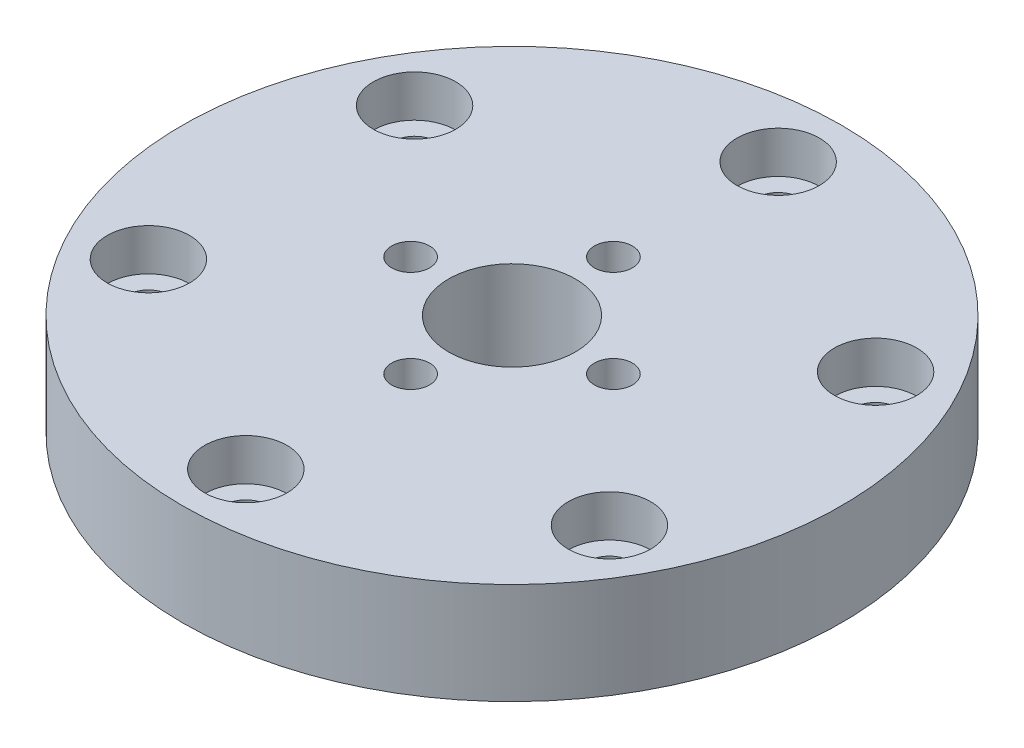
ISO-10303-21;
HEADER;
FILE_DESCRIPTION(('STEP AP214'),'2;1');
FILE_NAME('part.step','',(''),(''),'','','');
FILE_SCHEMA(('AUTOMOTIVE_DESIGN { 1 0 10303 214 1 1 1 1 }'));
ENDSEC;
DATA;
#1=APPLICATION_CONTEXT('core data for automotive mechanical design processes');
#2=APPLICATION_PROTOCOL_DEFINITION('international standard','automotive_design',2000,#1);
#3=PRODUCT_CONTEXT('',#1,'mechanical');
#4=PRODUCT('Part','Part','',(#3));
#5=PRODUCT_RELATED_PRODUCT_CATEGORY('part','',(#4));
#6=PRODUCT_DEFINITION_FORMATION('','',#4);
#7=PRODUCT_DEFINITION_CONTEXT('part definition',#1,'design');
#8=PRODUCT_DEFINITION('design','',#6,#7);
#9=PRODUCT_DEFINITION_SHAPE('','',#8);
#10=(LENGTH_UNIT() NAMED_UNIT(*) SI_UNIT(.MILLI.,.METRE.));
#11=(NAMED_UNIT(*) PLANE_ANGLE_UNIT() SI_UNIT($,.RADIAN.));
#12=(NAMED_UNIT(*) SI_UNIT($,.STERADIAN.) SOLID_ANGLE_UNIT());
#13=UNCERTAINTY_MEASURE_WITH_UNIT(LENGTH_MEASURE(1.E-05),#10,'distance_accuracy_value','');
#14=(GEOMETRIC_REPRESENTATION_CONTEXT(3) GLOBAL_UNCERTAINTY_ASSIGNED_CONTEXT((#13)) GLOBAL_UNIT_ASSIGNED_CONTEXT((#10,
#11,#12)) REPRESENTATION_CONTEXT('',''));
#15=CARTESIAN_POINT('',(0.,0.,0.));
#16=DIRECTION('',(0.,0.,1.));
#17=DIRECTION('',(1.,0.,0.));
#18=AXIS2_PLACEMENT_3D('',#15,#16,#17);
#19=CARTESIAN_POINT('',(0.,8.,-21.));
#20=DIRECTION('',(0.,-1.,0.));
#21=DIRECTION('',(0.,0.,-1.));
#22=AXIS2_PLACEMENT_3D('',#19,#20,#21);
#23=CYLINDRICAL_SURFACE('',#22,1.7);
#24=CARTESIAN_POINT('',(0.,0.,-21.));
#25=DIRECTION('',(0.,1.,0.));
#26=DIRECTION('',(0.,0.,1.));
#27=AXIS2_PLACEMENT_3D('',#24,#25,#26);
#28=CIRCLE('',#27,1.7);
#29=CARTESIAN_POINT('',(0.,0.,-19.3));
#30=VERTEX_POINT('',#29);
#31=EDGE_CURVE('E115',#30,#30,#28,.T.);
#32=ORIENTED_EDGE('',*,*,#31,.F.);
#33=EDGE_LOOP('',(#32));
#34=FACE_BOUND('',#33,.T.);
#35=CARTESIAN_POINT('',(0.,4.7,-21.));
#36=DIRECTION('',(0.,1.,0.));
#37=DIRECTION('',(0.,0.,1.));
#38=AXIS2_PLACEMENT_3D('',#35,#36,#37);
#39=CIRCLE('',#38,1.7);
#40=CARTESIAN_POINT('',(0.,4.7,-19.3));
#41=VERTEX_POINT('',#40);
#42=EDGE_CURVE('E47',#41,#41,#39,.T.);
#43=ORIENTED_EDGE('',*,*,#42,.T.);
#44=EDGE_LOOP('',(#43));
#45=FACE_BOUND('',#44,.T.);
#46=ADVANCED_FACE('F43',(#34,#45),#23,.F.);
#47=CARTESIAN_POINT('',(18.1865334794732,8.,-10.5));
#48=DIRECTION('',(0.,-1.,0.));
#49=DIRECTION('',(0.,0.,-1.));
#50=AXIS2_PLACEMENT_3D('',#47,#48,#49);
#51=CYLINDRICAL_SURFACE('',#50,1.7);
#52=CARTESIAN_POINT('',(18.1865334794732,0.,-10.5));
#53=DIRECTION('',(0.,1.,0.));
#54=DIRECTION('',(0.,0.,1.));
#55=AXIS2_PLACEMENT_3D('',#52,#53,#54);
#56=CIRCLE('',#55,1.7);
#57=CARTESIAN_POINT('',(18.1865334794732,0.,-8.8));
#58=VERTEX_POINT('',#57);
#59=EDGE_CURVE('E111',#58,#58,#56,.T.);
#60=ORIENTED_EDGE('',*,*,#59,.F.);
#61=EDGE_LOOP('',(#60));
#62=FACE_BOUND('',#61,.T.);
#63=CARTESIAN_POINT('',(18.1865334794732,4.7,-10.5));
#64=DIRECTION('',(0.,1.,0.));
#65=DIRECTION('',(0.,0.,1.));
#66=AXIS2_PLACEMENT_3D('',#63,#64,#65);
#67=CIRCLE('',#66,1.7);
#68=CARTESIAN_POINT('',(18.1865334794732,4.7,-8.8));
#69=VERTEX_POINT('',#68);
#70=EDGE_CURVE('E80',#69,#69,#67,.T.);
#71=ORIENTED_EDGE('',*,*,#70,.T.);
#72=EDGE_LOOP('',(#71));
#73=FACE_BOUND('',#72,.T.);
#74=ADVANCED_FACE('F175',(#62,#73),#51,.F.);
#75=CARTESIAN_POINT('',(18.1865334794732,8.,10.5));
#76=DIRECTION('',(0.,-1.,0.));
#77=DIRECTION('',(0.,0.,-1.));
#78=AXIS2_PLACEMENT_3D('',#75,#76,#77);
#79=CYLINDRICAL_SURFACE('',#78,1.7);
#80=CARTESIAN_POINT('',(18.1865334794732,0.,10.5));
#81=DIRECTION('',(0.,1.,0.));
#82=DIRECTION('',(0.,0.,1.));
#83=AXIS2_PLACEMENT_3D('',#80,#81,#82);
#84=CIRCLE('',#83,1.7);
#85=CARTESIAN_POINT('',(18.1865334794732,0.,12.2));
#86=VERTEX_POINT('',#85);
#87=EDGE_CURVE('E107',#86,#86,#84,.T.);
#88=ORIENTED_EDGE('',*,*,#87,.F.);
#89=EDGE_LOOP('',(#88));
#90=FACE_BOUND('',#89,.T.);
#91=CARTESIAN_POINT('',(18.1865334794732,4.7,10.5));
#92=DIRECTION('',(0.,1.,0.));
#93=DIRECTION('',(0.,0.,1.));
#94=AXIS2_PLACEMENT_3D('',#91,#92,#93);
#95=CIRCLE('',#94,1.7);
#96=CARTESIAN_POINT('',(18.1865334794732,4.7,12.2));
#97=VERTEX_POINT('',#96);
#98=EDGE_CURVE('E77',#97,#97,#95,.T.);
#99=ORIENTED_EDGE('',*,*,#98,.T.);
#100=EDGE_LOOP('',(#99));
#101=FACE_BOUND('',#100,.T.);
#102=ADVANCED_FACE('F182',(#90,#101),#79,.F.);
#103=CARTESIAN_POINT('',(0.,8.,21.));
#104=DIRECTION('',(0.,-1.,0.));
#105=DIRECTION('',(0.,0.,-1.));
#106=AXIS2_PLACEMENT_3D('',#103,#104,#105);
#107=CYLINDRICAL_SURFACE('',#106,1.7);
#108=CARTESIAN_POINT('',(0.,0.,21.));
#109=DIRECTION('',(0.,1.,0.));
#110=DIRECTION('',(0.,0.,1.));
#111=AXIS2_PLACEMENT_3D('',#108,#109,#110);
#112=CIRCLE('',#111,1.7);
#113=CARTESIAN_POINT('',(0.,0.,22.7));
#114=VERTEX_POINT('',#113);
#115=EDGE_CURVE('E98',#114,#114,#112,.T.);
#116=ORIENTED_EDGE('',*,*,#115,.F.);
#117=EDGE_LOOP('',(#116));
#118=FACE_BOUND('',#117,.T.);
#119=CARTESIAN_POINT('',(0.,4.7,21.));
#120=DIRECTION('',(0.,1.,0.));
#121=DIRECTION('',(0.,0.,1.));
#122=AXIS2_PLACEMENT_3D('',#119,#120,#121);
#123=CIRCLE('',#122,1.7);
#124=CARTESIAN_POINT('',(0.,4.7,22.7));
#125=VERTEX_POINT('',#124);
#126=EDGE_CURVE('E73',#125,#125,#123,.T.);
#127=ORIENTED_EDGE('',*,*,#126,.T.);
#128=EDGE_LOOP('',(#127));
#129=FACE_BOUND('',#128,.T.);
#130=ADVANCED_FACE('F225',(#118,#129),#107,.F.);
#131=CARTESIAN_POINT('',(-18.1865334794732,8.,10.5));
#132=DIRECTION('',(0.,-1.,0.));
#133=DIRECTION('',(0.,0.,-1.));
#134=AXIS2_PLACEMENT_3D('',#131,#132,#133);
#135=CYLINDRICAL_SURFACE('',#134,1.7);
#136=CARTESIAN_POINT('',(-18.1865334794732,0.,10.5));
#137=DIRECTION('',(0.,1.,0.));
#138=DIRECTION('',(0.,0.,1.));
#139=AXIS2_PLACEMENT_3D('',#136,#137,#138);
#140=CIRCLE('',#139,1.7);
#141=CARTESIAN_POINT('',(-18.1865334794732,0.,12.2));
#142=VERTEX_POINT('',#141);
#143=EDGE_CURVE('E92',#142,#142,#140,.T.);
#144=ORIENTED_EDGE('',*,*,#143,.F.);
#145=EDGE_LOOP('',(#144));
#146=FACE_BOUND('',#145,.T.);
#147=CARTESIAN_POINT('',(-18.1865334794732,4.7,10.5));
#148=DIRECTION('',(0.,1.,0.));
#149=DIRECTION('',(0.,0.,1.));
#150=AXIS2_PLACEMENT_3D('',#147,#148,#149);
#151=CIRCLE('',#150,1.7);
#152=CARTESIAN_POINT('',(-18.1865334794732,4.7,12.2));
#153=VERTEX_POINT('',#152);
#154=EDGE_CURVE('E68',#153,#153,#151,.T.);
#155=ORIENTED_EDGE('',*,*,#154,.T.);
#156=EDGE_LOOP('',(#155));
#157=FACE_BOUND('',#156,.T.);
#158=ADVANCED_FACE('F221',(#146,#157),#135,.F.);
#159=CARTESIAN_POINT('',(-18.1865334794732,8.,-10.5));
#160=DIRECTION('',(0.,-1.,0.));
#161=DIRECTION('',(0.,0.,-1.));
#162=AXIS2_PLACEMENT_3D('',#159,#160,#161);
#163=CYLINDRICAL_SURFACE('',#162,1.7);
#164=CARTESIAN_POINT('',(-18.1865334794732,0.,-10.5));
#165=DIRECTION('',(0.,1.,0.));
#166=DIRECTION('',(0.,0.,1.));
#167=AXIS2_PLACEMENT_3D('',#164,#165,#166);
#168=CIRCLE('',#167,1.7);
#169=CARTESIAN_POINT('',(-18.1865334794732,0.,-8.79999999999999));
#170=VERTEX_POINT('',#169);
#171=EDGE_CURVE('E87',#170,#170,#168,.T.);
#172=ORIENTED_EDGE('',*,*,#171,.F.);
#173=EDGE_LOOP('',(#172));
#174=FACE_BOUND('',#173,.T.);
#175=CARTESIAN_POINT('',(-18.1865334794732,4.7,-10.5));
#176=DIRECTION('',(0.,1.,0.));
#177=DIRECTION('',(0.,0.,1.));
#178=AXIS2_PLACEMENT_3D('',#175,#176,#177);
#179=CIRCLE('',#178,1.7);
#180=CARTESIAN_POINT('',(-18.1865334794732,4.7,-8.79999999999999));
#181=VERTEX_POINT('',#180);
#182=EDGE_CURVE('E64',#181,#181,#179,.T.);
#183=ORIENTED_EDGE('',*,*,#182,.T.);
#184=EDGE_LOOP('',(#183));
#185=FACE_BOUND('',#184,.T.);
#186=ADVANCED_FACE('F224',(#174,#185),#163,.F.);
#187=CARTESIAN_POINT('',(0.,8.,0.));
#188=DIRECTION('',(0.,1.,0.));
#189=DIRECTION('',(0.,0.,1.));
#190=AXIS2_PLACEMENT_3D('',#187,#188,#189);
#191=PLANE('',#190);
#192=CARTESIAN_POINT('',(0.,8.,-21.));
#193=DIRECTION('',(0.,1.,0.));
#194=DIRECTION('',(0.,0.,1.));
#195=AXIS2_PLACEMENT_3D('',#192,#193,#194);
#196=CIRCLE('',#195,3.25);
#197=CARTESIAN_POINT('',(0.,8.,-17.75));
#198=VERTEX_POINT('',#197);
#199=EDGE_CURVE('E254',#198,#198,#196,.T.);
#200=ORIENTED_EDGE('',*,*,#199,.F.);
#201=EDGE_LOOP('',(#200));
#202=FACE_BOUND('',#201,.T.);
#203=CARTESIAN_POINT('',(-18.1865334794732,8.,-10.5));
#204=DIRECTION('',(0.,1.,0.));
#205=DIRECTION('',(0.,0.,1.));
#206=AXIS2_PLACEMENT_3D('',#203,#204,#205);
#207=CIRCLE('',#206,3.25);
#208=CARTESIAN_POINT('',(-18.1865334794732,8.,-7.24999999999999));
#209=VERTEX_POINT('',#208);
#210=EDGE_CURVE('E240',#209,#209,#207,.T.);
#211=ORIENTED_EDGE('',*,*,#210,.F.);
#212=EDGE_LOOP('',(#211));
#213=FACE_BOUND('',#212,.T.);
#214=CARTESIAN_POINT('',(-18.1865334794732,8.,10.5));
#215=DIRECTION('',(0.,1.,0.));
#216=DIRECTION('',(0.,0.,1.));
#217=AXIS2_PLACEMENT_3D('',#214,#215,#216);
#218=CIRCLE('',#217,3.25);
#219=CARTESIAN_POINT('',(-18.1865334794732,8.,13.75));
#220=VERTEX_POINT('',#219);
#221=EDGE_CURVE('E239',#220,#220,#218,.T.);
#222=ORIENTED_EDGE('',*,*,#221,.F.);
#223=EDGE_LOOP('',(#222));
#224=FACE_BOUND('',#223,.T.);
#225=CARTESIAN_POINT('',(0.,8.,21.));
#226=DIRECTION('',(0.,1.,0.));
#227=DIRECTION('',(0.,0.,1.));
#228=AXIS2_PLACEMENT_3D('',#225,#226,#227);
#229=CIRCLE('',#228,3.25);
#230=CARTESIAN_POINT('',(0.,8.,24.25));
#231=VERTEX_POINT('',#230);
#232=EDGE_CURVE('E273',#231,#231,#229,.T.);
#233=ORIENTED_EDGE('',*,*,#232,.F.);
#234=EDGE_LOOP('',(#233));
#235=FACE_BOUND('',#234,.T.);
#236=CARTESIAN_POINT('',(18.1865334794732,8.,10.5));
#237=DIRECTION('',(0.,1.,0.));
#238=DIRECTION('',(0.,0.,1.));
#239=AXIS2_PLACEMENT_3D('',#236,#237,#238);
#240=CIRCLE('',#239,3.25);
#241=CARTESIAN_POINT('',(18.1865334794732,8.,13.75));
#242=VERTEX_POINT('',#241);
#243=EDGE_CURVE('E265',#242,#242,#240,.T.);
#244=ORIENTED_EDGE('',*,*,#243,.F.);
#245=EDGE_LOOP('',(#244));
#246=FACE_BOUND('',#245,.T.);
#247=CARTESIAN_POINT('',(18.1865334794732,8.,-10.5));
#248=DIRECTION('',(0.,1.,0.));
#249=DIRECTION('',(0.,0.,1.));
#250=AXIS2_PLACEMENT_3D('',#247,#248,#249);
#251=CIRCLE('',#250,3.25);
#252=CARTESIAN_POINT('',(18.1865334794732,8.,-7.25000000000001));
#253=VERTEX_POINT('',#252);
#254=EDGE_CURVE('E257',#253,#253,#251,.T.);
#255=ORIENTED_EDGE('',*,*,#254,.F.);
#256=EDGE_LOOP('',(#255));
#257=FACE_BOUND('',#256,.T.);
#258=CARTESIAN_POINT('',(0.,8.,8.));
#259=DIRECTION('',(0.,1.,0.));
#260=DIRECTION('',(0.,0.,1.));
#261=AXIS2_PLACEMENT_3D('',#258,#259,#260);
#262=CIRCLE('',#261,1.5);
#263=CARTESIAN_POINT('',(0.,8.,9.5));
#264=VERTEX_POINT('',#263);
#265=EDGE_CURVE('E128',#264,#264,#262,.T.);
#266=ORIENTED_EDGE('',*,*,#265,.F.);
#267=EDGE_LOOP('',(#266));
#268=FACE_BOUND('',#267,.T.);
#269=CARTESIAN_POINT('',(0.,8.,-8.));
#270=DIRECTION('',(0.,1.,0.));
#271=DIRECTION('',(0.,0.,1.));
#272=AXIS2_PLACEMENT_3D('',#269,#270,#271);
#273=CIRCLE('',#272,1.5);
#274=CARTESIAN_POINT('',(0.,8.,-6.5));
#275=VERTEX_POINT('',#274);
#276=EDGE_CURVE('E144',#275,#275,#273,.T.);
#277=ORIENTED_EDGE('',*,*,#276,.F.);
#278=EDGE_LOOP('',(#277));
#279=FACE_BOUND('',#278,.T.);
#280=CARTESIAN_POINT('',(0.,8.,0.));
#281=DIRECTION('',(0.,1.,0.));
#282=DIRECTION('',(0.,0.,1.));
#283=AXIS2_PLACEMENT_3D('',#280,#281,#282);
#284=CIRCLE('',#283,26.);
#285=CARTESIAN_POINT('',(0.,8.,26.));
#286=VERTEX_POINT('',#285);
#287=EDGE_CURVE('E10',#286,#286,#284,.T.);
#288=ORIENTED_EDGE('',*,*,#287,.T.);
#289=EDGE_LOOP('',(#288));
#290=FACE_BOUND('',#289,.T.);
#291=CARTESIAN_POINT('',(0.,8.,0.));
#292=DIRECTION('',(0.,1.,0.));
#293=DIRECTION('',(0.,0.,1.));
#294=AXIS2_PLACEMENT_3D('',#291,#292,#293);
#295=CIRCLE('',#294,5.);
#296=CARTESIAN_POINT('',(0.,8.,5.));
#297=VERTEX_POINT('',#296);
#298=EDGE_CURVE('E58',#297,#297,#295,.T.);
#299=ORIENTED_EDGE('',*,*,#298,.F.);
#300=EDGE_LOOP('',(#299));
#301=FACE_BOUND('',#300,.T.);
#302=CARTESIAN_POINT('',(8.,8.,0.));
#303=DIRECTION('',(0.,1.,0.));
#304=DIRECTION('',(0.,0.,1.));
#305=AXIS2_PLACEMENT_3D('',#302,#303,#304);
#306=CIRCLE('',#305,1.5);
#307=CARTESIAN_POINT('',(8.,8.,1.5));
#308=VERTEX_POINT('',#307);
#309=EDGE_CURVE('E136',#308,#308,#306,.T.);
#310=ORIENTED_EDGE('',*,*,#309,.F.);
#311=EDGE_LOOP('',(#310));
#312=FACE_BOUND('',#311,.T.);
#313=CARTESIAN_POINT('',(-8.,8.,0.));
#314=DIRECTION('',(0.,1.,0.));
#315=DIRECTION('',(0.,0.,1.));
#316=AXIS2_PLACEMENT_3D('',#313,#314,#315);
#317=CIRCLE('',#316,1.5);
#318=CARTESIAN_POINT('',(-8.,8.,1.5));
#319=VERTEX_POINT('',#318);
#320=EDGE_CURVE('E120',#319,#319,#317,.T.);
#321=ORIENTED_EDGE('',*,*,#320,.F.);
#322=EDGE_LOOP('',(#321));
#323=FACE_BOUND('',#322,.T.);
#324=ADVANCED_FACE('F206',(#202,#213,#224,#235,#246,#257,#268,#279,#290,#301,#312,#323),#191,.T.);
#325=CARTESIAN_POINT('',(0.,0.,0.));
#326=DIRECTION('',(0.,1.,0.));
#327=DIRECTION('',(0.,0.,1.));
#328=AXIS2_PLACEMENT_3D('',#325,#326,#327);
#329=PLANE('',#328);
#330=CARTESIAN_POINT('',(0.,0.,0.));
#331=DIRECTION('',(0.,1.,0.));
#332=DIRECTION('',(0.,0.,1.));
#333=AXIS2_PLACEMENT_3D('',#330,#331,#332);
#334=CIRCLE('',#333,26.);
#335=CARTESIAN_POINT('',(0.,0.,26.));
#336=VERTEX_POINT('',#335);
#337=EDGE_CURVE('E52',#336,#336,#334,.T.);
#338=ORIENTED_EDGE('',*,*,#337,.F.);
#339=EDGE_LOOP('',(#338));
#340=FACE_BOUND('',#339,.T.);
#341=CARTESIAN_POINT('',(0.,0.,0.));
#342=DIRECTION('',(0.,1.,0.));
#343=DIRECTION('',(0.,0.,1.));
#344=AXIS2_PLACEMENT_3D('',#341,#342,#343);
#345=CIRCLE('',#344,5.);
#346=CARTESIAN_POINT('',(0.,0.,5.));
#347=VERTEX_POINT('',#346);
#348=EDGE_CURVE('E61',#347,#347,#345,.T.);
#349=ORIENTED_EDGE('',*,*,#348,.T.);
#350=EDGE_LOOP('',(#349));
#351=FACE_BOUND('',#350,.T.);
#352=CARTESIAN_POINT('',(0.,0.,-8.));
#353=DIRECTION('',(0.,1.,0.));
#354=DIRECTION('',(0.,0.,1.));
#355=AXIS2_PLACEMENT_3D('',#352,#353,#354);
#356=CIRCLE('',#355,1.5);
#357=CARTESIAN_POINT('',(0.,0.,-6.5));
#358=VERTEX_POINT('',#357);
#359=EDGE_CURVE('E140',#358,#358,#356,.T.);
#360=ORIENTED_EDGE('',*,*,#359,.T.);
#361=EDGE_LOOP('',(#360));
#362=FACE_BOUND('',#361,.T.);
#363=CARTESIAN_POINT('',(8.,0.,0.));
#364=DIRECTION('',(0.,1.,0.));
#365=DIRECTION('',(0.,0.,1.));
#366=AXIS2_PLACEMENT_3D('',#363,#364,#365);
#367=CIRCLE('',#366,1.5);
#368=CARTESIAN_POINT('',(8.,0.,1.5));
#369=VERTEX_POINT('',#368);
#370=EDGE_CURVE('E132',#369,#369,#367,.T.);
#371=ORIENTED_EDGE('',*,*,#370,.T.);
#372=EDGE_LOOP('',(#371));
#373=FACE_BOUND('',#372,.T.);
#374=CARTESIAN_POINT('',(0.,0.,8.));
#375=DIRECTION('',(0.,1.,0.));
#376=DIRECTION('',(0.,0.,1.));
#377=AXIS2_PLACEMENT_3D('',#374,#375,#376);
#378=CIRCLE('',#377,1.5);
#379=CARTESIAN_POINT('',(0.,0.,9.5));
#380=VERTEX_POINT('',#379);
#381=EDGE_CURVE('E124',#380,#380,#378,.T.);
#382=ORIENTED_EDGE('',*,*,#381,.T.);
#383=EDGE_LOOP('',(#382));
#384=FACE_BOUND('',#383,.T.);
#385=CARTESIAN_POINT('',(-8.,0.,0.));
#386=DIRECTION('',(0.,1.,0.));
#387=DIRECTION('',(0.,0.,1.));
#388=AXIS2_PLACEMENT_3D('',#385,#386,#387);
#389=CIRCLE('',#388,1.5);
#390=CARTESIAN_POINT('',(-8.,0.,1.5));
#391=VERTEX_POINT('',#390);
#392=EDGE_CURVE('E119',#391,#391,#389,.T.);
#393=ORIENTED_EDGE('',*,*,#392,.T.);
#394=EDGE_LOOP('',(#393));
#395=FACE_BOUND('',#394,.T.);
#396=ORIENTED_EDGE('',*,*,#31,.T.);
#397=EDGE_LOOP('',(#396));
#398=FACE_BOUND('',#397,.T.);
#399=ORIENTED_EDGE('',*,*,#59,.T.);
#400=EDGE_LOOP('',(#399));
#401=FACE_BOUND('',#400,.T.);
#402=ORIENTED_EDGE('',*,*,#87,.T.);
#403=EDGE_LOOP('',(#402));
#404=FACE_BOUND('',#403,.T.);
#405=ORIENTED_EDGE('',*,*,#115,.T.);
#406=EDGE_LOOP('',(#405));
#407=FACE_BOUND('',#406,.T.);
#408=ORIENTED_EDGE('',*,*,#143,.T.);
#409=EDGE_LOOP('',(#408));
#410=FACE_BOUND('',#409,.T.);
#411=ORIENTED_EDGE('',*,*,#171,.T.);
#412=EDGE_LOOP('',(#411));
#413=FACE_BOUND('',#412,.T.);
#414=ADVANCED_FACE('F158',(#340,#351,#362,#373,#384,#395,#398,#401,#404,#407,#410,#413),#329,.F.);
#415=CARTESIAN_POINT('',(0.,8.,0.));
#416=DIRECTION('',(0.,-1.,0.));
#417=DIRECTION('',(0.,0.,-1.));
#418=AXIS2_PLACEMENT_3D('',#415,#416,#417);
#419=CYLINDRICAL_SURFACE('',#418,26.);
#420=ORIENTED_EDGE('',*,*,#287,.F.);
#421=EDGE_LOOP('',(#420));
#422=FACE_BOUND('',#421,.T.);
#423=ORIENTED_EDGE('',*,*,#337,.T.);
#424=EDGE_LOOP('',(#423));
#425=FACE_BOUND('',#424,.T.);
#426=ADVANCED_FACE('F45',(#422,#425),#419,.T.);
#427=CARTESIAN_POINT('',(0.,8.,0.));
#428=DIRECTION('',(0.,-1.,0.));
#429=DIRECTION('',(0.,0.,-1.));
#430=AXIS2_PLACEMENT_3D('',#427,#428,#429);
#431=CYLINDRICAL_SURFACE('',#430,5.);
#432=ORIENTED_EDGE('',*,*,#298,.T.);
#433=EDGE_LOOP('',(#432));
#434=FACE_BOUND('',#433,.T.);
#435=ORIENTED_EDGE('',*,*,#348,.F.);
#436=EDGE_LOOP('',(#435));
#437=FACE_BOUND('',#436,.T.);
#438=ADVANCED_FACE('F161',(#434,#437),#431,.F.);
#439=CARTESIAN_POINT('',(0.,8.,-8.));
#440=DIRECTION('',(0.,-1.,0.));
#441=DIRECTION('',(0.,0.,-1.));
#442=AXIS2_PLACEMENT_3D('',#439,#440,#441);
#443=CYLINDRICAL_SURFACE('',#442,1.5);
#444=ORIENTED_EDGE('',*,*,#276,.T.);
#445=EDGE_LOOP('',(#444));
#446=FACE_BOUND('',#445,.T.);
#447=ORIENTED_EDGE('',*,*,#359,.F.);
#448=EDGE_LOOP('',(#447));
#449=FACE_BOUND('',#448,.T.);
#450=ADVANCED_FACE('F163',(#446,#449),#443,.F.);
#451=CARTESIAN_POINT('',(8.,8.,0.));
#452=DIRECTION('',(0.,-1.,0.));
#453=DIRECTION('',(0.,0.,-1.));
#454=AXIS2_PLACEMENT_3D('',#451,#452,#453);
#455=CYLINDRICAL_SURFACE('',#454,1.5);
#456=ORIENTED_EDGE('',*,*,#309,.T.);
#457=EDGE_LOOP('',(#456));
#458=FACE_BOUND('',#457,.T.);
#459=ORIENTED_EDGE('',*,*,#370,.F.);
#460=EDGE_LOOP('',(#459));
#461=FACE_BOUND('',#460,.T.);
#462=ADVANCED_FACE('F169',(#458,#461),#455,.F.);
#463=CARTESIAN_POINT('',(0.,8.,8.));
#464=DIRECTION('',(0.,-1.,0.));
#465=DIRECTION('',(0.,0.,-1.));
#466=AXIS2_PLACEMENT_3D('',#463,#464,#465);
#467=CYLINDRICAL_SURFACE('',#466,1.5);
#468=ORIENTED_EDGE('',*,*,#265,.T.);
#469=EDGE_LOOP('',(#468));
#470=FACE_BOUND('',#469,.T.);
#471=ORIENTED_EDGE('',*,*,#381,.F.);
#472=EDGE_LOOP('',(#471));
#473=FACE_BOUND('',#472,.T.);
#474=ADVANCED_FACE('F191',(#470,#473),#467,.F.);
#475=CARTESIAN_POINT('',(-8.,8.,0.));
#476=DIRECTION('',(0.,-1.,0.));
#477=DIRECTION('',(0.,0.,-1.));
#478=AXIS2_PLACEMENT_3D('',#475,#476,#477);
#479=CYLINDRICAL_SURFACE('',#478,1.5);
#480=ORIENTED_EDGE('',*,*,#320,.T.);
#481=EDGE_LOOP('',(#480));
#482=FACE_BOUND('',#481,.T.);
#483=ORIENTED_EDGE('',*,*,#392,.F.);
#484=EDGE_LOOP('',(#483));
#485=FACE_BOUND('',#484,.T.);
#486=ADVANCED_FACE('F188',(#482,#485),#479,.F.);
#487=CARTESIAN_POINT('',(-18.1865334794732,4.7,-10.5));
#488=DIRECTION('',(0.,1.,0.));
#489=DIRECTION('',(0.,0.,1.));
#490=AXIS2_PLACEMENT_3D('',#487,#488,#489);
#491=CYLINDRICAL_SURFACE('',#490,3.25);
#492=CARTESIAN_POINT('',(-18.1865334794732,4.7,-10.5));
#493=DIRECTION('',(0.,1.,0.));
#494=DIRECTION('',(0.,0.,1.));
#495=AXIS2_PLACEMENT_3D('',#492,#493,#494);
#496=CIRCLE('',#495,3.25);
#497=CARTESIAN_POINT('',(-18.1865334794732,4.7,-7.24999999999999));
#498=VERTEX_POINT('',#497);
#499=EDGE_CURVE('E246',#498,#498,#496,.T.);
#500=ORIENTED_EDGE('',*,*,#499,.F.);
#501=EDGE_LOOP('',(#500));
#502=FACE_BOUND('',#501,.T.);
#503=ORIENTED_EDGE('',*,*,#210,.T.);
#504=EDGE_LOOP('',(#503));
#505=FACE_BOUND('',#504,.T.);
#506=ADVANCED_FACE('F190',(#502,#505),#491,.F.);
#507=CARTESIAN_POINT('',(-18.1865334794732,4.7,-10.5));
#508=DIRECTION('',(0.,1.,0.));
#509=DIRECTION('',(0.,0.,1.));
#510=AXIS2_PLACEMENT_3D('',#507,#508,#509);
#511=PLANE('',#510);
#512=ORIENTED_EDGE('',*,*,#182,.F.);
#513=EDGE_LOOP('',(#512));
#514=FACE_BOUND('',#513,.T.);
#515=ORIENTED_EDGE('',*,*,#499,.T.);
#516=EDGE_LOOP('',(#515));
#517=FACE_BOUND('',#516,.T.);
#518=ADVANCED_FACE('F325',(#514,#517),#511,.T.);
#519=CARTESIAN_POINT('',(-18.1865334794732,4.7,10.5));
#520=DIRECTION('',(0.,1.,0.));
#521=DIRECTION('',(0.,0.,1.));
#522=AXIS2_PLACEMENT_3D('',#519,#520,#521);
#523=CYLINDRICAL_SURFACE('',#522,3.25);
#524=CARTESIAN_POINT('',(-18.1865334794732,4.7,10.5));
#525=DIRECTION('',(0.,1.,0.));
#526=DIRECTION('',(0.,0.,1.));
#527=AXIS2_PLACEMENT_3D('',#524,#525,#526);
#528=CIRCLE('',#527,3.25);
#529=CARTESIAN_POINT('',(-18.1865334794732,4.7,13.75));
#530=VERTEX_POINT('',#529);
#531=EDGE_CURVE('E101',#530,#530,#528,.T.);
#532=ORIENTED_EDGE('',*,*,#531,.F.);
#533=EDGE_LOOP('',(#532));
#534=FACE_BOUND('',#533,.T.);
#535=ORIENTED_EDGE('',*,*,#221,.T.);
#536=EDGE_LOOP('',(#535));
#537=FACE_BOUND('',#536,.T.);
#538=ADVANCED_FACE('F233',(#534,#537),#523,.F.);
#539=CARTESIAN_POINT('',(-18.1865334794732,4.7,10.5));
#540=DIRECTION('',(0.,1.,0.));
#541=DIRECTION('',(0.,0.,1.));
#542=AXIS2_PLACEMENT_3D('',#539,#540,#541);
#543=PLANE('',#542);
#544=ORIENTED_EDGE('',*,*,#154,.F.);
#545=EDGE_LOOP('',(#544));
#546=FACE_BOUND('',#545,.T.);
#547=ORIENTED_EDGE('',*,*,#531,.T.);
#548=EDGE_LOOP('',(#547));
#549=FACE_BOUND('',#548,.T.);
#550=ADVANCED_FACE('F229',(#546,#549),#543,.T.);
#551=CARTESIAN_POINT('',(0.,4.7,21.));
#552=DIRECTION('',(0.,1.,0.));
#553=DIRECTION('',(0.,0.,1.));
#554=AXIS2_PLACEMENT_3D('',#551,#552,#553);
#555=CYLINDRICAL_SURFACE('',#554,3.25);
#556=CARTESIAN_POINT('',(0.,4.7,21.));
#557=DIRECTION('',(0.,1.,0.));
#558=DIRECTION('',(0.,0.,1.));
#559=AXIS2_PLACEMENT_3D('',#556,#557,#558);
#560=CIRCLE('',#559,3.25);
#561=CARTESIAN_POINT('',(0.,4.7,24.25));
#562=VERTEX_POINT('',#561);
#563=EDGE_CURVE('E244',#562,#562,#560,.T.);
#564=ORIENTED_EDGE('',*,*,#563,.F.);
#565=EDGE_LOOP('',(#564));
#566=FACE_BOUND('',#565,.T.);
#567=ORIENTED_EDGE('',*,*,#232,.T.);
#568=EDGE_LOOP('',(#567));
#569=FACE_BOUND('',#568,.T.);
#570=ADVANCED_FACE('F232',(#566,#569),#555,.F.);
#571=CARTESIAN_POINT('',(0.,4.7,21.));
#572=DIRECTION('',(0.,1.,0.));
#573=DIRECTION('',(0.,0.,1.));
#574=AXIS2_PLACEMENT_3D('',#571,#572,#573);
#575=PLANE('',#574);
#576=ORIENTED_EDGE('',*,*,#126,.F.);
#577=EDGE_LOOP('',(#576));
#578=FACE_BOUND('',#577,.T.);
#579=ORIENTED_EDGE('',*,*,#563,.T.);
#580=EDGE_LOOP('',(#579));
#581=FACE_BOUND('',#580,.T.);
#582=ADVANCED_FACE('F281',(#578,#581),#575,.T.);
#583=CARTESIAN_POINT('',(18.1865334794732,4.7,10.5));
#584=DIRECTION('',(0.,1.,0.));
#585=DIRECTION('',(0.,0.,1.));
#586=AXIS2_PLACEMENT_3D('',#583,#584,#585);
#587=CYLINDRICAL_SURFACE('',#586,3.25);
#588=CARTESIAN_POINT('',(18.1865334794732,4.7,10.5));
#589=DIRECTION('',(0.,1.,0.));
#590=DIRECTION('',(0.,0.,1.));
#591=AXIS2_PLACEMENT_3D('',#588,#589,#590);
#592=CIRCLE('',#591,3.25);
#593=CARTESIAN_POINT('',(18.1865334794732,4.7,13.75));
#594=VERTEX_POINT('',#593);
#595=EDGE_CURVE('E269',#594,#594,#592,.T.);
#596=ORIENTED_EDGE('',*,*,#595,.F.);
#597=EDGE_LOOP('',(#596));
#598=FACE_BOUND('',#597,.T.);
#599=ORIENTED_EDGE('',*,*,#243,.T.);
#600=EDGE_LOOP('',(#599));
#601=FACE_BOUND('',#600,.T.);
#602=ADVANCED_FACE('F320',(#598,#601),#587,.F.);
#603=CARTESIAN_POINT('',(18.1865334794732,4.7,10.5));
#604=DIRECTION('',(0.,1.,0.));
#605=DIRECTION('',(0.,0.,1.));
#606=AXIS2_PLACEMENT_3D('',#603,#604,#605);
#607=PLANE('',#606);
#608=ORIENTED_EDGE('',*,*,#98,.F.);
#609=EDGE_LOOP('',(#608));
#610=FACE_BOUND('',#609,.T.);
#611=ORIENTED_EDGE('',*,*,#595,.T.);
#612=EDGE_LOOP('',(#611));
#613=FACE_BOUND('',#612,.T.);
#614=ADVANCED_FACE('F310',(#610,#613),#607,.T.);
#615=CARTESIAN_POINT('',(18.1865334794732,4.7,-10.5));
#616=DIRECTION('',(0.,1.,0.));
#617=DIRECTION('',(0.,0.,1.));
#618=AXIS2_PLACEMENT_3D('',#615,#616,#617);
#619=CYLINDRICAL_SURFACE('',#618,3.25);
#620=CARTESIAN_POINT('',(18.1865334794732,4.7,-10.5));
#621=DIRECTION('',(0.,1.,0.));
#622=DIRECTION('',(0.,0.,1.));
#623=AXIS2_PLACEMENT_3D('',#620,#621,#622);
#624=CIRCLE('',#623,3.25);
#625=CARTESIAN_POINT('',(18.1865334794732,4.7,-7.25000000000001));
#626=VERTEX_POINT('',#625);
#627=EDGE_CURVE('E261',#626,#626,#624,.T.);
#628=ORIENTED_EDGE('',*,*,#627,.F.);
#629=EDGE_LOOP('',(#628));
#630=FACE_BOUND('',#629,.T.);
#631=ORIENTED_EDGE('',*,*,#254,.T.);
#632=EDGE_LOOP('',(#631));
#633=FACE_BOUND('',#632,.T.);
#634=ADVANCED_FACE('F307',(#630,#633),#619,.F.);
#635=CARTESIAN_POINT('',(18.1865334794732,4.7,-10.5));
#636=DIRECTION('',(0.,1.,0.));
#637=DIRECTION('',(0.,0.,1.));
#638=AXIS2_PLACEMENT_3D('',#635,#636,#637);
#639=PLANE('',#638);
#640=ORIENTED_EDGE('',*,*,#70,.F.);
#641=EDGE_LOOP('',(#640));
#642=FACE_BOUND('',#641,.T.);
#643=ORIENTED_EDGE('',*,*,#627,.T.);
#644=EDGE_LOOP('',(#643));
#645=FACE_BOUND('',#644,.T.);
#646=ADVANCED_FACE('F309',(#642,#645),#639,.T.);
#647=CARTESIAN_POINT('',(0.,4.7,-21.));
#648=DIRECTION('',(0.,1.,0.));
#649=DIRECTION('',(0.,0.,1.));
#650=AXIS2_PLACEMENT_3D('',#647,#648,#649);
#651=CYLINDRICAL_SURFACE('',#650,3.25);
#652=CARTESIAN_POINT('',(0.,4.7,-21.));
#653=DIRECTION('',(0.,1.,0.));
#654=DIRECTION('',(0.,0.,1.));
#655=AXIS2_PLACEMENT_3D('',#652,#653,#654);
#656=CIRCLE('',#655,3.25);
#657=CARTESIAN_POINT('',(0.,4.7,-17.75));
#658=VERTEX_POINT('',#657);
#659=EDGE_CURVE('E69',#658,#658,#656,.T.);
#660=ORIENTED_EDGE('',*,*,#659,.F.);
#661=EDGE_LOOP('',(#660));
#662=FACE_BOUND('',#661,.T.);
#663=ORIENTED_EDGE('',*,*,#199,.T.);
#664=EDGE_LOOP('',(#663));
#665=FACE_BOUND('',#664,.T.);
#666=ADVANCED_FACE('F317',(#662,#665),#651,.F.);
#667=CARTESIAN_POINT('',(0.,4.7,-21.));
#668=DIRECTION('',(0.,1.,0.));
#669=DIRECTION('',(0.,0.,1.));
#670=AXIS2_PLACEMENT_3D('',#667,#668,#669);
#671=PLANE('',#670);
#672=ORIENTED_EDGE('',*,*,#42,.F.);
#673=EDGE_LOOP('',(#672));
#674=FACE_BOUND('',#673,.T.);
#675=ORIENTED_EDGE('',*,*,#659,.T.);
#676=EDGE_LOOP('',(#675));
#677=FACE_BOUND('',#676,.T.);
#678=ADVANCED_FACE('F435',(#674,#677),#671,.T.);
#679=CLOSED_SHELL('',(#46,#74,#102,#130,#158,#186,#324,#414,#426,#438,#450,#462,#474,#486,#506,
#518,#538,#550,#570,#582,#602,#614,#634,#646,#666,#678));
#680=MANIFOLD_SOLID_BREP('B2',#679);
#681=ADVANCED_BREP_SHAPE_REPRESENTATION('',(#18,#680),#14);
#682=SHAPE_DEFINITION_REPRESENTATION(#9,#681);
ENDSEC;
END-ISO-10303-21;
